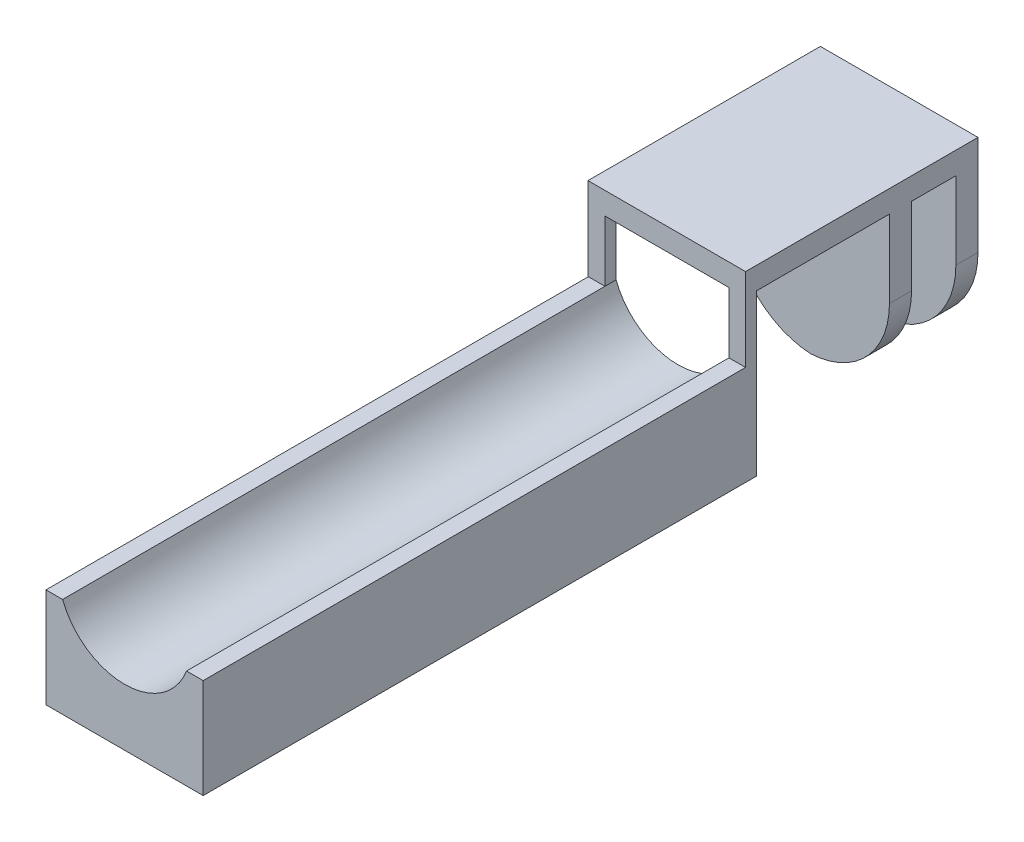
ISO-10303-21;
HEADER;
FILE_DESCRIPTION(('STEP AP214'),'2;1');
FILE_NAME('part.step','',(''),(''),'','','');
FILE_SCHEMA(('AUTOMOTIVE_DESIGN { 1 0 10303 214 1 1 1 1 }'));
ENDSEC;
DATA;
#1=APPLICATION_CONTEXT('core data for automotive mechanical design processes');
#2=APPLICATION_PROTOCOL_DEFINITION('international standard','automotive_design',2000,#1);
#3=PRODUCT_CONTEXT('',#1,'mechanical');
#4=PRODUCT('Part','Part','',(#3));
#5=PRODUCT_RELATED_PRODUCT_CATEGORY('part','',(#4));
#6=PRODUCT_DEFINITION_FORMATION('','',#4);
#7=PRODUCT_DEFINITION_CONTEXT('part definition',#1,'design');
#8=PRODUCT_DEFINITION('design','',#6,#7);
#9=PRODUCT_DEFINITION_SHAPE('','',#8);
#10=(LENGTH_UNIT() NAMED_UNIT(*) SI_UNIT(.MILLI.,.METRE.));
#11=(NAMED_UNIT(*) PLANE_ANGLE_UNIT() SI_UNIT($,.RADIAN.));
#12=(NAMED_UNIT(*) SI_UNIT($,.STERADIAN.) SOLID_ANGLE_UNIT());
#13=UNCERTAINTY_MEASURE_WITH_UNIT(LENGTH_MEASURE(1.E-05),#10,'distance_accuracy_value','');
#14=(GEOMETRIC_REPRESENTATION_CONTEXT(3) GLOBAL_UNCERTAINTY_ASSIGNED_CONTEXT((#13)) GLOBAL_UNIT_ASSIGNED_CONTEXT((#10,
#11,#12)) REPRESENTATION_CONTEXT('',''));
#15=CARTESIAN_POINT('',(0.,0.,0.));
#16=DIRECTION('',(0.,0.,1.));
#17=DIRECTION('',(1.,0.,0.));
#18=AXIS2_PLACEMENT_3D('',#15,#16,#17);
#19=CARTESIAN_POINT('',(0.,110.,20.));
#20=DIRECTION('',(0.,-1.,0.));
#21=DIRECTION('',(0.,0.,-1.));
#22=AXIS2_PLACEMENT_3D('',#19,#20,#21);
#23=PLANE('',#22);
#24=DIRECTION('',(0.,0.,1.));
#25=VECTOR('',#24,1.);
#26=CARTESIAN_POINT('',(-254.767845468869,110.,-400.));
#27=LINE('',#26,#25);
#28=CARTESIAN_POINT('',(-254.767845468869,110.,-240.));
#29=VERTEX_POINT('',#28);
#30=CARTESIAN_POINT('',(-254.767845468869,110.,0.));
#31=VERTEX_POINT('',#30);
#32=EDGE_CURVE('E225',#29,#31,#27,.T.);
#33=ORIENTED_EDGE('',*,*,#32,.F.);
#34=DIRECTION('',(-1.,0.,0.));
#35=VECTOR('',#34,1.);
#36=CARTESIAN_POINT('',(-254.767845468869,110.,-240.));
#37=LINE('',#36,#35);
#38=CARTESIAN_POINT('',(30.,110.,-240.));
#39=VERTEX_POINT('',#38);
#40=EDGE_CURVE('E215',#39,#29,#37,.T.);
#41=ORIENTED_EDGE('',*,*,#40,.F.);
#42=DIRECTION('',(0.,0.,1.));
#43=VECTOR('',#42,1.);
#44=CARTESIAN_POINT('',(30.,110.,-400.));
#45=LINE('',#44,#43);
#46=CARTESIAN_POINT('',(30.,110.,0.));
#47=VERTEX_POINT('',#46);
#48=EDGE_CURVE('E224',#39,#47,#45,.T.);
#49=ORIENTED_EDGE('',*,*,#48,.T.);
#50=DIRECTION('',(-1.,0.,0.));
#51=VECTOR('',#50,1.);
#52=CARTESIAN_POINT('',(30.,110.,0.));
#53=LINE('',#52,#51);
#54=CARTESIAN_POINT('',(0.,110.,0.));
#55=VERTEX_POINT('',#54);
#56=EDGE_CURVE('E230',#47,#55,#53,.T.);
#57=ORIENTED_EDGE('',*,*,#56,.T.);
#58=DIRECTION('',(0.,0.,-1.));
#59=VECTOR('',#58,1.);
#60=CARTESIAN_POINT('',(0.,110.,20.));
#61=LINE('',#60,#59);
#62=CARTESIAN_POINT('',(0.,110.,20.));
#63=VERTEX_POINT('',#62);
#64=EDGE_CURVE('E257',#63,#55,#61,.T.);
#65=ORIENTED_EDGE('',*,*,#64,.F.);
#66=DIRECTION('',(-1.,0.,0.));
#67=VECTOR('',#66,1.);
#68=CARTESIAN_POINT('',(0.,110.,20.));
#69=LINE('',#68,#67);
#70=CARTESIAN_POINT('',(-223.996890486914,110.,20.));
#71=VERTEX_POINT('',#70);
#72=EDGE_CURVE('E237',#63,#71,#69,.T.);
#73=ORIENTED_EDGE('',*,*,#72,.T.);
#74=DIRECTION('',(0.,0.,-1.));
#75=VECTOR('',#74,1.);
#76=CARTESIAN_POINT('',(-223.996890486914,110.,20.));
#77=LINE('',#76,#75);
#78=CARTESIAN_POINT('',(-223.996890486914,110.,0.));
#79=VERTEX_POINT('',#78);
#80=EDGE_CURVE('E282',#71,#79,#77,.T.);
#81=ORIENTED_EDGE('',*,*,#80,.T.);
#82=EDGE_CURVE('E327',#79,#31,#53,.T.);
#83=ORIENTED_EDGE('',*,*,#82,.T.);
#84=EDGE_LOOP('',(#33,#41,#49,#57,#65,#73,#81,#83));
#85=FACE_BOUND('',#84,.T.);
#86=ADVANCED_FACE('F43',(#85),#23,.T.);
#87=CARTESIAN_POINT('',(30.,110.,-360.));
#88=VERTEX_POINT('',#87);
#89=CARTESIAN_POINT('',(30.,110.,-280.));
#90=VERTEX_POINT('',#89);
#91=EDGE_CURVE('E214',#88,#90,#45,.T.);
#92=ORIENTED_EDGE('',*,*,#91,.T.);
#93=DIRECTION('',(1.,0.,0.));
#94=VECTOR('',#93,1.);
#95=CARTESIAN_POINT('',(-254.767845468869,110.,-280.));
#96=LINE('',#95,#94);
#97=CARTESIAN_POINT('',(-254.767845468869,110.,-280.));
#98=VERTEX_POINT('',#97);
#99=EDGE_CURVE('E198',#98,#90,#96,.T.);
#100=ORIENTED_EDGE('',*,*,#99,.F.);
#101=CARTESIAN_POINT('',(-254.767845468869,110.,-360.));
#102=VERTEX_POINT('',#101);
#103=EDGE_CURVE('E212',#102,#98,#27,.T.);
#104=ORIENTED_EDGE('',*,*,#103,.F.);
#105=DIRECTION('',(-1.,0.,0.));
#106=VECTOR('',#105,1.);
#107=CARTESIAN_POINT('',(-254.767845468869,110.,-360.));
#108=LINE('',#107,#106);
#109=EDGE_CURVE('E205',#88,#102,#108,.T.);
#110=ORIENTED_EDGE('',*,*,#109,.F.);
#111=EDGE_LOOP('',(#92,#100,#104,#110));
#112=FACE_BOUND('',#111,.T.);
#113=ADVANCED_FACE('F210',(#112),#23,.T.);
#114=CARTESIAN_POINT('',(-223.996890486914,0.,1000.));
#115=DIRECTION('',(0.,-1.,0.));
#116=DIRECTION('',(1.,0.,0.));
#117=AXIS2_PLACEMENT_3D('',#114,#115,#116);
#118=PLANE('',#117);
#119=DIRECTION('',(1.,0.,0.));
#120=VECTOR('',#119,1.);
#121=CARTESIAN_POINT('',(0.,0.,20.));
#122=LINE('',#121,#120);
#123=CARTESIAN_POINT('',(-253.996890486914,0.,20.));
#124=VERTEX_POINT('',#123);
#125=CARTESIAN_POINT('',(-223.996890486914,0.,20.));
#126=VERTEX_POINT('',#125);
#127=EDGE_CURVE('E243',#124,#126,#122,.T.);
#128=ORIENTED_EDGE('',*,*,#127,.F.);
#129=DIRECTION('',(0.,0.,-1.));
#130=VECTOR('',#129,1.);
#131=CARTESIAN_POINT('',(-253.996890486914,0.,1000.));
#132=LINE('',#131,#130);
#133=CARTESIAN_POINT('',(-253.996890486914,0.,1000.));
#134=VERTEX_POINT('',#133);
#135=EDGE_CURVE('E321',#134,#124,#132,.T.);
#136=ORIENTED_EDGE('',*,*,#135,.F.);
#137=DIRECTION('',(-1.,0.,0.));
#138=VECTOR('',#137,1.);
#139=CARTESIAN_POINT('',(-223.996890486914,0.,1000.));
#140=LINE('',#139,#138);
#141=CARTESIAN_POINT('',(-223.996890486914,0.,1000.));
#142=VERTEX_POINT('',#141);
#143=EDGE_CURVE('E292',#142,#134,#140,.T.);
#144=ORIENTED_EDGE('',*,*,#143,.F.);
#145=DIRECTION('',(0.,0.,-1.));
#146=VECTOR('',#145,1.);
#147=CARTESIAN_POINT('',(-223.996890486914,0.,1000.));
#148=LINE('',#147,#146);
#149=EDGE_CURVE('E324',#142,#126,#148,.T.);
#150=ORIENTED_EDGE('',*,*,#149,.T.);
#151=EDGE_LOOP('',(#128,#136,#144,#150));
#152=FACE_BOUND('',#151,.T.);
#153=ADVANCED_FACE('F426',(#152),#118,.F.);
#154=CARTESIAN_POINT('',(30.,0.,1000.));
#155=DIRECTION('',(0.,-1.,0.));
#156=DIRECTION('',(1.,0.,0.));
#157=AXIS2_PLACEMENT_3D('',#154,#155,#156);
#158=PLANE('',#157);
#159=DIRECTION('',(1.,0.,0.));
#160=VECTOR('',#159,1.);
#161=CARTESIAN_POINT('',(0.,0.,20.));
#162=LINE('',#161,#160);
#163=CARTESIAN_POINT('',(0.,0.,20.));
#164=VERTEX_POINT('',#163);
#165=CARTESIAN_POINT('',(30.,0.,20.));
#166=VERTEX_POINT('',#165);
#167=EDGE_CURVE('E254',#164,#166,#162,.T.);
#168=ORIENTED_EDGE('',*,*,#167,.F.);
#169=DIRECTION('',(0.,0.,-1.));
#170=VECTOR('',#169,1.);
#171=CARTESIAN_POINT('',(0.,0.,1000.));
#172=LINE('',#171,#170);
#173=CARTESIAN_POINT('',(0.,0.,1000.));
#174=VERTEX_POINT('',#173);
#175=EDGE_CURVE('E303',#174,#164,#172,.T.);
#176=ORIENTED_EDGE('',*,*,#175,.F.);
#177=DIRECTION('',(-1.,0.,0.));
#178=VECTOR('',#177,1.);
#179=CARTESIAN_POINT('',(30.,0.,1000.));
#180=LINE('',#179,#178);
#181=CARTESIAN_POINT('',(30.,0.,1000.));
#182=VERTEX_POINT('',#181);
#183=EDGE_CURVE('E301',#182,#174,#180,.T.);
#184=ORIENTED_EDGE('',*,*,#183,.F.);
#185=DIRECTION('',(0.,0.,-1.));
#186=VECTOR('',#185,1.);
#187=CARTESIAN_POINT('',(30.,0.,1000.));
#188=LINE('',#187,#186);
#189=EDGE_CURVE('E313',#182,#166,#188,.T.);
#190=ORIENTED_EDGE('',*,*,#189,.T.);
#191=EDGE_LOOP('',(#168,#176,#184,#190));
#192=FACE_BOUND('',#191,.T.);
#193=ADVANCED_FACE('F446',(#192),#158,.F.);
#194=CARTESIAN_POINT('',(-111.998445243457,43.0853601940189,1000.));
#195=DIRECTION('',(0.,0.,-1.));
#196=DIRECTION('',(-1.,0.,0.));
#197=AXIS2_PLACEMENT_3D('',#194,#195,#196);
#198=CYLINDRICAL_SURFACE('',#197,120.);
#199=CARTESIAN_POINT('',(-111.998445243457,43.0853601940189,0.));
#200=DIRECTION('',(0.,0.,-1.));
#201=DIRECTION('',(-1.,0.,0.));
#202=AXIS2_PLACEMENT_3D('',#199,#200,#201);
#203=CIRCLE('',#202,120.);
#204=CARTESIAN_POINT('',(0.,0.,0.));
#205=VERTEX_POINT('',#204);
#206=CARTESIAN_POINT('',(-223.996890486914,0.,0.));
#207=VERTEX_POINT('',#206);
#208=EDGE_CURVE('E288',#205,#207,#203,.T.);
#209=ORIENTED_EDGE('',*,*,#208,.T.);
#210=DIRECTION('',(0.,0.,-1.));
#211=VECTOR('',#210,1.);
#212=CARTESIAN_POINT('',(-223.996890486914,0.,20.));
#213=LINE('',#212,#211);
#214=EDGE_CURVE('E279',#126,#207,#213,.T.);
#215=ORIENTED_EDGE('',*,*,#214,.F.);
#216=ORIENTED_EDGE('',*,*,#149,.F.);
#217=CARTESIAN_POINT('',(-111.998445243457,43.0853601940189,1000.));
#218=DIRECTION('',(0.,0.,-1.));
#219=DIRECTION('',(-1.,0.,0.));
#220=AXIS2_PLACEMENT_3D('',#217,#218,#219);
#221=CIRCLE('',#220,120.);
#222=EDGE_CURVE('E289',#174,#142,#221,.T.);
#223=ORIENTED_EDGE('',*,*,#222,.F.);
#224=ORIENTED_EDGE('',*,*,#175,.T.);
#225=DIRECTION('',(0.,0.,-1.));
#226=VECTOR('',#225,1.);
#227=CARTESIAN_POINT('',(0.,0.,20.));
#228=LINE('',#227,#226);
#229=EDGE_CURVE('E268',#164,#205,#228,.T.);
#230=ORIENTED_EDGE('',*,*,#229,.T.);
#231=EDGE_LOOP('',(#209,#215,#216,#223,#224,#230));
#232=FACE_BOUND('',#231,.T.);
#233=ADVANCED_FACE('F449',(#232),#198,.F.);
#234=CARTESIAN_POINT('',(-253.996890486914,0.,1000.));
#235=DIRECTION('',(1.,0.,0.));
#236=DIRECTION('',(0.,0.,-1.));
#237=AXIS2_PLACEMENT_3D('',#234,#235,#236);
#238=PLANE('',#237);
#239=DIRECTION('',(0.,-1.,0.));
#240=VECTOR('',#239,1.);
#241=CARTESIAN_POINT('',(-253.996890486914,0.,0.));
#242=LINE('',#241,#240);
#243=CARTESIAN_POINT('',(-253.996890486914,0.,0.));
#244=VERTEX_POINT('',#243);
#245=CARTESIAN_POINT('',(-253.996890486914,-180.,0.));
#246=VERTEX_POINT('',#245);
#247=EDGE_CURVE('E305',#244,#246,#242,.T.);
#248=ORIENTED_EDGE('',*,*,#247,.T.);
#249=DIRECTION('',(0.,0.,-1.));
#250=VECTOR('',#249,1.);
#251=CARTESIAN_POINT('',(-253.996890486914,-180.,1000.));
#252=LINE('',#251,#250);
#253=CARTESIAN_POINT('',(-253.996890486914,-180.,1000.));
#254=VERTEX_POINT('',#253);
#255=EDGE_CURVE('E318',#254,#246,#252,.T.);
#256=ORIENTED_EDGE('',*,*,#255,.F.);
#257=DIRECTION('',(0.,-1.,0.));
#258=VECTOR('',#257,1.);
#259=CARTESIAN_POINT('',(-253.996890486914,0.,1000.));
#260=LINE('',#259,#258);
#261=EDGE_CURVE('E295',#134,#254,#260,.T.);
#262=ORIENTED_EDGE('',*,*,#261,.F.);
#263=ORIENTED_EDGE('',*,*,#135,.T.);
#264=DIRECTION('',(0.,0.,1.));
#265=VECTOR('',#264,1.);
#266=CARTESIAN_POINT('',(-253.996890486914,0.,1000.));
#267=LINE('',#266,#265);
#268=EDGE_CURVE('E271',#244,#124,#267,.T.);
#269=ORIENTED_EDGE('',*,*,#268,.F.);
#270=EDGE_LOOP('',(#248,#256,#262,#263,#269));
#271=FACE_BOUND('',#270,.T.);
#272=ADVANCED_FACE('F456',(#271),#238,.F.);
#273=CARTESIAN_POINT('',(-253.996890486914,-180.,1000.));
#274=DIRECTION('',(0.,1.,0.));
#275=DIRECTION('',(0.,0.,1.));
#276=AXIS2_PLACEMENT_3D('',#273,#274,#275);
#277=PLANE('',#276);
#278=DIRECTION('',(1.,0.,0.));
#279=VECTOR('',#278,1.);
#280=CARTESIAN_POINT('',(-253.996890486914,-180.,0.));
#281=LINE('',#280,#279);
#282=CARTESIAN_POINT('',(30.,-180.,0.));
#283=VERTEX_POINT('',#282);
#284=EDGE_CURVE('E307',#246,#283,#281,.T.);
#285=ORIENTED_EDGE('',*,*,#284,.T.);
#286=DIRECTION('',(0.,0.,-1.));
#287=VECTOR('',#286,1.);
#288=CARTESIAN_POINT('',(30.,-180.,1000.));
#289=LINE('',#288,#287);
#290=CARTESIAN_POINT('',(30.,-180.,1000.));
#291=VERTEX_POINT('',#290);
#292=EDGE_CURVE('E315',#291,#283,#289,.T.);
#293=ORIENTED_EDGE('',*,*,#292,.F.);
#294=DIRECTION('',(1.,0.,0.));
#295=VECTOR('',#294,1.);
#296=CARTESIAN_POINT('',(-253.996890486914,-180.,1000.));
#297=LINE('',#296,#295);
#298=EDGE_CURVE('E297',#254,#291,#297,.T.);
#299=ORIENTED_EDGE('',*,*,#298,.F.);
#300=ORIENTED_EDGE('',*,*,#255,.T.);
#301=EDGE_LOOP('',(#285,#293,#299,#300));
#302=FACE_BOUND('',#301,.T.);
#303=ADVANCED_FACE('F453',(#302),#277,.F.);
#304=CARTESIAN_POINT('',(30.,-180.,1000.));
#305=DIRECTION('',(-1.,0.,0.));
#306=DIRECTION('',(0.,0.,1.));
#307=AXIS2_PLACEMENT_3D('',#304,#305,#306);
#308=PLANE('',#307);
#309=DIRECTION('',(0.,1.,0.));
#310=VECTOR('',#309,1.);
#311=CARTESIAN_POINT('',(30.,-467.56342919951,-360.));
#312=LINE('',#311,#310);
#313=CARTESIAN_POINT('',(30.,-30.,-360.));
#314=VERTEX_POINT('',#313);
#315=EDGE_CURVE('E381',#314,#88,#312,.T.);
#316=ORIENTED_EDGE('',*,*,#315,.F.);
#317=DIRECTION('',(0.,0.,-1.));
#318=VECTOR('',#317,1.);
#319=CARTESIAN_POINT('',(30.,-30.,1000.));
#320=LINE('',#319,#318);
#321=CARTESIAN_POINT('',(30.,-30.,-400.));
#322=VERTEX_POINT('',#321);
#323=EDGE_CURVE('E347',#314,#322,#320,.T.);
#324=ORIENTED_EDGE('',*,*,#323,.T.);
#325=DIRECTION('',(0.,-1.,0.));
#326=VECTOR('',#325,1.);
#327=CARTESIAN_POINT('',(30.,150.,-400.));
#328=LINE('',#327,#326);
#329=CARTESIAN_POINT('',(30.,150.,-400.));
#330=VERTEX_POINT('',#329);
#331=EDGE_CURVE('E383',#330,#322,#328,.T.);
#332=ORIENTED_EDGE('',*,*,#331,.F.);
#333=DIRECTION('',(0.,0.,-1.));
#334=VECTOR('',#333,1.);
#335=CARTESIAN_POINT('',(30.,150.,20.));
#336=LINE('',#335,#334);
#337=CARTESIAN_POINT('',(30.,150.,20.));
#338=VERTEX_POINT('',#337);
#339=EDGE_CURVE('E272',#338,#330,#336,.T.);
#340=ORIENTED_EDGE('',*,*,#339,.F.);
#341=DIRECTION('',(0.,1.,0.));
#342=VECTOR('',#341,1.);
#343=CARTESIAN_POINT('',(30.,0.,20.));
#344=LINE('',#343,#342);
#345=EDGE_CURVE('E252',#166,#338,#344,.T.);
#346=ORIENTED_EDGE('',*,*,#345,.F.);
#347=ORIENTED_EDGE('',*,*,#189,.F.);
#348=DIRECTION('',(0.,1.,0.));
#349=VECTOR('',#348,1.);
#350=CARTESIAN_POINT('',(30.,-180.,1000.));
#351=LINE('',#350,#349);
#352=EDGE_CURVE('E299',#291,#182,#351,.T.);
#353=ORIENTED_EDGE('',*,*,#352,.F.);
#354=ORIENTED_EDGE('',*,*,#292,.T.);
#355=DIRECTION('',(0.,1.,0.));
#356=VECTOR('',#355,1.);
#357=CARTESIAN_POINT('',(30.,-180.,0.));
#358=LINE('',#357,#356);
#359=EDGE_CURVE('E293',#283,#47,#358,.T.);
#360=ORIENTED_EDGE('',*,*,#359,.T.);
#361=ORIENTED_EDGE('',*,*,#48,.F.);
#362=DIRECTION('',(0.,1.,0.));
#363=VECTOR('',#362,1.);
#364=CARTESIAN_POINT('',(30.,-467.56342919951,-240.));
#365=LINE('',#364,#363);
#366=CARTESIAN_POINT('',(30.,-30.,-240.));
#367=VERTEX_POINT('',#366);
#368=EDGE_CURVE('E367',#367,#39,#365,.T.);
#369=ORIENTED_EDGE('',*,*,#368,.F.);
#370=DIRECTION('',(0.,0.,-1.));
#371=VECTOR('',#370,1.);
#372=CARTESIAN_POINT('',(30.,-30.,1000.));
#373=LINE('',#372,#371);
#374=CARTESIAN_POINT('',(30.,-30.,-280.));
#375=VERTEX_POINT('',#374);
#376=EDGE_CURVE('E345',#367,#375,#373,.T.);
#377=ORIENTED_EDGE('',*,*,#376,.T.);
#378=DIRECTION('',(0.,1.,0.));
#379=VECTOR('',#378,1.);
#380=CARTESIAN_POINT('',(30.,-467.56342919951,-280.));
#381=LINE('',#380,#379);
#382=EDGE_CURVE('E206',#375,#90,#381,.T.);
#383=ORIENTED_EDGE('',*,*,#382,.T.);
#384=ORIENTED_EDGE('',*,*,#91,.F.);
#385=EDGE_LOOP('',(#316,#324,#332,#340,#346,#347,#353,#354,#360,#361,#369,#377,#383,#384));
#386=FACE_BOUND('',#385,.T.);
#387=ADVANCED_FACE('F372',(#386),#308,.F.);
#388=CARTESIAN_POINT('',(-111.998445243457,43.0853601940189,1000.));
#389=DIRECTION('',(0.,0.,-1.));
#390=DIRECTION('',(-1.,0.,0.));
#391=AXIS2_PLACEMENT_3D('',#388,#389,#390);
#392=PLANE('',#391);
#393=ORIENTED_EDGE('',*,*,#222,.T.);
#394=ORIENTED_EDGE('',*,*,#143,.T.);
#395=ORIENTED_EDGE('',*,*,#261,.T.);
#396=ORIENTED_EDGE('',*,*,#298,.T.);
#397=ORIENTED_EDGE('',*,*,#352,.T.);
#398=ORIENTED_EDGE('',*,*,#183,.T.);
#399=EDGE_LOOP('',(#393,#394,#395,#396,#397,#398));
#400=FACE_BOUND('',#399,.T.);
#401=ADVANCED_FACE('F438',(#400),#392,.F.);
#402=CARTESIAN_POINT('',(-111.998445243457,43.0853601940189,0.));
#403=DIRECTION('',(0.,0.,-1.));
#404=DIRECTION('',(-1.,0.,0.));
#405=AXIS2_PLACEMENT_3D('',#402,#403,#404);
#406=PLANE('',#405);
#407=ORIENTED_EDGE('',*,*,#56,.F.);
#408=ORIENTED_EDGE('',*,*,#359,.F.);
#409=ORIENTED_EDGE('',*,*,#284,.F.);
#410=ORIENTED_EDGE('',*,*,#247,.F.);
#411=DIRECTION('',(1.,0.,0.));
#412=VECTOR('',#411,1.);
#413=CARTESIAN_POINT('',(0.,0.,0.));
#414=LINE('',#413,#412);
#415=CARTESIAN_POINT('',(-254.767845468869,0.,0.));
#416=VERTEX_POINT('',#415);
#417=EDGE_CURVE('E263',#416,#244,#414,.T.);
#418=ORIENTED_EDGE('',*,*,#417,.F.);
#419=DIRECTION('',(0.,1.,0.));
#420=VECTOR('',#419,1.);
#421=CARTESIAN_POINT('',(-254.767845468869,0.,0.));
#422=LINE('',#421,#420);
#423=EDGE_CURVE('E238',#416,#31,#422,.T.);
#424=ORIENTED_EDGE('',*,*,#423,.T.);
#425=ORIENTED_EDGE('',*,*,#82,.F.);
#426=DIRECTION('',(0.,1.,0.));
#427=VECTOR('',#426,1.);
#428=CARTESIAN_POINT('',(-223.996890486914,0.,0.));
#429=LINE('',#428,#427);
#430=EDGE_CURVE('E260',#207,#79,#429,.T.);
#431=ORIENTED_EDGE('',*,*,#430,.F.);
#432=ORIENTED_EDGE('',*,*,#208,.F.);
#433=DIRECTION('',(0.,1.,0.));
#434=VECTOR('',#433,1.);
#435=CARTESIAN_POINT('',(0.,0.,0.));
#436=LINE('',#435,#434);
#437=EDGE_CURVE('E233',#205,#55,#436,.T.);
#438=ORIENTED_EDGE('',*,*,#437,.T.);
#439=EDGE_LOOP('',(#407,#408,#409,#410,#418,#424,#425,#431,#432,#438));
#440=FACE_BOUND('',#439,.T.);
#441=ADVANCED_FACE('F441',(#440),#406,.T.);
#442=CARTESIAN_POINT('',(0.,0.,20.));
#443=DIRECTION('',(0.,1.,0.));
#444=DIRECTION('',(-1.,0.,0.));
#445=AXIS2_PLACEMENT_3D('',#442,#443,#444);
#446=PLANE('',#445);
#447=ORIENTED_EDGE('',*,*,#417,.T.);
#448=ORIENTED_EDGE('',*,*,#268,.T.);
#449=CARTESIAN_POINT('',(-254.767845468869,0.,20.));
#450=VERTEX_POINT('',#449);
#451=EDGE_CURVE('E244',#450,#124,#122,.T.);
#452=ORIENTED_EDGE('',*,*,#451,.F.);
#453=DIRECTION('',(0.,0.,-1.));
#454=VECTOR('',#453,1.);
#455=CARTESIAN_POINT('',(-254.767845468869,0.,20.));
#456=LINE('',#455,#454);
#457=EDGE_CURVE('E277',#450,#416,#456,.T.);
#458=ORIENTED_EDGE('',*,*,#457,.T.);
#459=EDGE_LOOP('',(#447,#448,#452,#458));
#460=FACE_BOUND('',#459,.T.);
#461=ADVANCED_FACE('F436',(#460),#446,.F.);
#462=CARTESIAN_POINT('',(0.,0.,20.));
#463=DIRECTION('',(-1.,0.,0.));
#464=DIRECTION('',(0.,0.,1.));
#465=AXIS2_PLACEMENT_3D('',#462,#463,#464);
#466=PLANE('',#465);
#467=ORIENTED_EDGE('',*,*,#437,.F.);
#468=ORIENTED_EDGE('',*,*,#229,.F.);
#469=DIRECTION('',(0.,1.,0.));
#470=VECTOR('',#469,1.);
#471=CARTESIAN_POINT('',(0.,0.,20.));
#472=LINE('',#471,#470);
#473=EDGE_CURVE('E234',#164,#63,#472,.T.);
#474=ORIENTED_EDGE('',*,*,#473,.T.);
#475=ORIENTED_EDGE('',*,*,#64,.T.);
#476=EDGE_LOOP('',(#467,#468,#474,#475));
#477=FACE_BOUND('',#476,.T.);
#478=ADVANCED_FACE('F432',(#477),#466,.T.);
#479=CARTESIAN_POINT('',(0.,150.,20.));
#480=DIRECTION('',(0.,-1.,0.));
#481=DIRECTION('',(0.,0.,-1.));
#482=AXIS2_PLACEMENT_3D('',#479,#480,#481);
#483=PLANE('',#482);
#484=ORIENTED_EDGE('',*,*,#339,.T.);
#485=DIRECTION('',(1.,0.,0.));
#486=VECTOR('',#485,1.);
#487=CARTESIAN_POINT('',(30.,150.,-400.));
#488=LINE('',#487,#486);
#489=CARTESIAN_POINT('',(-254.767845468869,150.,-400.));
#490=VERTEX_POINT('',#489);
#491=EDGE_CURVE('E228',#490,#330,#488,.T.);
#492=ORIENTED_EDGE('',*,*,#491,.F.);
#493=DIRECTION('',(0.,0.,-1.));
#494=VECTOR('',#493,1.);
#495=CARTESIAN_POINT('',(-254.767845468869,150.,20.));
#496=LINE('',#495,#494);
#497=CARTESIAN_POINT('',(-254.767845468869,150.,20.));
#498=VERTEX_POINT('',#497);
#499=EDGE_CURVE('E274',#498,#490,#496,.T.);
#500=ORIENTED_EDGE('',*,*,#499,.F.);
#501=DIRECTION('',(-1.,0.,0.));
#502=VECTOR('',#501,1.);
#503=CARTESIAN_POINT('',(0.,150.,20.));
#504=LINE('',#503,#502);
#505=EDGE_CURVE('E250',#338,#498,#504,.T.);
#506=ORIENTED_EDGE('',*,*,#505,.F.);
#507=EDGE_LOOP('',(#484,#492,#500,#506));
#508=FACE_BOUND('',#507,.T.);
#509=ADVANCED_FACE('F435',(#508),#483,.F.);
#510=CARTESIAN_POINT('',(-254.767845468869,0.,20.));
#511=DIRECTION('',(-1.,0.,0.));
#512=DIRECTION('',(0.,0.,1.));
#513=AXIS2_PLACEMENT_3D('',#510,#511,#512);
#514=PLANE('',#513);
#515=DIRECTION('',(0.,1.,0.));
#516=VECTOR('',#515,1.);
#517=CARTESIAN_POINT('',(-254.767845468869,150.,-400.));
#518=LINE('',#517,#516);
#519=CARTESIAN_POINT('',(-254.767845468869,-30.,-400.));
#520=VERTEX_POINT('',#519);
#521=EDGE_CURVE('E386',#520,#490,#518,.T.);
#522=ORIENTED_EDGE('',*,*,#521,.F.);
#523=DIRECTION('',(0.,0.,1.));
#524=VECTOR('',#523,1.);
#525=CARTESIAN_POINT('',(-254.767845468869,-30.,-360.));
#526=LINE('',#525,#524);
#527=CARTESIAN_POINT('',(-254.767845468869,-30.,-360.));
#528=VERTEX_POINT('',#527);
#529=EDGE_CURVE('E335',#520,#528,#526,.T.);
#530=ORIENTED_EDGE('',*,*,#529,.T.);
#531=DIRECTION('',(0.,1.,0.));
#532=VECTOR('',#531,1.);
#533=CARTESIAN_POINT('',(-254.767845468869,-467.56342919951,-360.));
#534=LINE('',#533,#532);
#535=EDGE_CURVE('E222',#528,#102,#534,.T.);
#536=ORIENTED_EDGE('',*,*,#535,.T.);
#537=ORIENTED_EDGE('',*,*,#103,.T.);
#538=DIRECTION('',(0.,1.,0.));
#539=VECTOR('',#538,1.);
#540=CARTESIAN_POINT('',(-254.767845468869,-467.56342919951,-280.));
#541=LINE('',#540,#539);
#542=CARTESIAN_POINT('',(-254.767845468869,-30.,-280.));
#543=VERTEX_POINT('',#542);
#544=EDGE_CURVE('E195',#543,#98,#541,.T.);
#545=ORIENTED_EDGE('',*,*,#544,.F.);
#546=DIRECTION('',(0.,0.,1.));
#547=VECTOR('',#546,1.);
#548=CARTESIAN_POINT('',(-254.767845468869,-30.,-240.));
#549=LINE('',#548,#547);
#550=CARTESIAN_POINT('',(-254.767845468869,-30.,-240.));
#551=VERTEX_POINT('',#550);
#552=EDGE_CURVE('E333',#543,#551,#549,.T.);
#553=ORIENTED_EDGE('',*,*,#552,.T.);
#554=DIRECTION('',(0.,1.,0.));
#555=VECTOR('',#554,1.);
#556=CARTESIAN_POINT('',(-254.767845468869,-467.56342919951,-240.));
#557=LINE('',#556,#555);
#558=EDGE_CURVE('E373',#551,#29,#557,.T.);
#559=ORIENTED_EDGE('',*,*,#558,.T.);
#560=ORIENTED_EDGE('',*,*,#32,.T.);
#561=ORIENTED_EDGE('',*,*,#423,.F.);
#562=ORIENTED_EDGE('',*,*,#457,.F.);
#563=DIRECTION('',(0.,1.,0.));
#564=VECTOR('',#563,1.);
#565=CARTESIAN_POINT('',(-254.767845468869,0.,20.));
#566=LINE('',#565,#564);
#567=EDGE_CURVE('E247',#450,#498,#566,.T.);
#568=ORIENTED_EDGE('',*,*,#567,.T.);
#569=ORIENTED_EDGE('',*,*,#499,.T.);
#570=EDGE_LOOP('',(#522,#530,#536,#537,#545,#553,#559,#560,#561,#562,#568,#569));
#571=FACE_BOUND('',#570,.T.);
#572=ADVANCED_FACE('F219',(#571),#514,.T.);
#573=CARTESIAN_POINT('',(-223.996890486914,0.,20.));
#574=DIRECTION('',(-1.,0.,0.));
#575=DIRECTION('',(0.,0.,1.));
#576=AXIS2_PLACEMENT_3D('',#573,#574,#575);
#577=PLANE('',#576);
#578=ORIENTED_EDGE('',*,*,#430,.T.);
#579=ORIENTED_EDGE('',*,*,#80,.F.);
#580=DIRECTION('',(0.,1.,0.));
#581=VECTOR('',#580,1.);
#582=CARTESIAN_POINT('',(-223.996890486914,0.,20.));
#583=LINE('',#582,#581);
#584=EDGE_CURVE('E241',#126,#71,#583,.T.);
#585=ORIENTED_EDGE('',*,*,#584,.F.);
#586=ORIENTED_EDGE('',*,*,#214,.T.);
#587=EDGE_LOOP('',(#578,#579,#585,#586));
#588=FACE_BOUND('',#587,.T.);
#589=ADVANCED_FACE('F430',(#588),#577,.F.);
#590=CARTESIAN_POINT('',(0.,0.,20.));
#591=DIRECTION('',(0.,0.,-1.));
#592=DIRECTION('',(-1.,0.,0.));
#593=AXIS2_PLACEMENT_3D('',#590,#591,#592);
#594=PLANE('',#593);
#595=ORIENTED_EDGE('',*,*,#473,.F.);
#596=ORIENTED_EDGE('',*,*,#167,.T.);
#597=ORIENTED_EDGE('',*,*,#345,.T.);
#598=ORIENTED_EDGE('',*,*,#505,.T.);
#599=ORIENTED_EDGE('',*,*,#567,.F.);
#600=ORIENTED_EDGE('',*,*,#451,.T.);
#601=ORIENTED_EDGE('',*,*,#127,.T.);
#602=ORIENTED_EDGE('',*,*,#584,.T.);
#603=ORIENTED_EDGE('',*,*,#72,.F.);
#604=EDGE_LOOP('',(#595,#596,#597,#598,#599,#600,#601,#602,#603));
#605=FACE_BOUND('',#604,.T.);
#606=ADVANCED_FACE('F415',(#605),#594,.F.);
#607=CARTESIAN_POINT('',(0.,0.,-400.));
#608=DIRECTION('',(0.,0.,-1.));
#609=DIRECTION('',(-1.,0.,0.));
#610=AXIS2_PLACEMENT_3D('',#607,#608,#609);
#611=PLANE('',#610);
#612=CARTESIAN_POINT('',(-111.998445243457,43.0853601940189,-400.));
#613=DIRECTION('',(0.,0.,-1.));
#614=DIRECTION('',(-1.,0.,0.));
#615=AXIS2_PLACEMENT_3D('',#612,#613,#614);
#616=CIRCLE('',#615,12.);
#617=CARTESIAN_POINT('',(-123.998445243457,43.0853601940189,-400.));
#618=VERTEX_POINT('',#617);
#619=EDGE_CURVE('E332',#618,#618,#616,.T.);
#620=ORIENTED_EDGE('',*,*,#619,.F.);
#621=EDGE_LOOP('',(#620));
#622=FACE_BOUND('',#621,.T.);
#623=CARTESIAN_POINT('',(-120.,-30.,-400.));
#624=DIRECTION('',(0.,0.,-1.));
#625=DIRECTION('',(-1.,0.,0.));
#626=AXIS2_PLACEMENT_3D('',#623,#624,#625);
#627=CIRCLE('',#626,150.);
#628=CARTESIAN_POINT('',(-112.383922734434,-179.806526450235,-400.));
#629=VERTEX_POINT('',#628);
#630=EDGE_CURVE('E341',#322,#629,#627,.T.);
#631=ORIENTED_EDGE('',*,*,#630,.T.);
#632=CARTESIAN_POINT('',(-104.767845468869,-30.,-400.));
#633=DIRECTION('',(0.,0.,-1.));
#634=DIRECTION('',(-1.,0.,0.));
#635=AXIS2_PLACEMENT_3D('',#632,#633,#634);
#636=CIRCLE('',#635,150.);
#637=EDGE_CURVE('E343',#629,#520,#636,.T.);
#638=ORIENTED_EDGE('',*,*,#637,.T.);
#639=ORIENTED_EDGE('',*,*,#521,.T.);
#640=ORIENTED_EDGE('',*,*,#491,.T.);
#641=ORIENTED_EDGE('',*,*,#331,.T.);
#642=EDGE_LOOP('',(#631,#638,#639,#640,#641));
#643=FACE_BOUND('',#642,.T.);
#644=ADVANCED_FACE('F391',(#622,#643),#611,.T.);
#645=CARTESIAN_POINT('',(-254.767845468869,-467.56342919951,-360.));
#646=DIRECTION('',(0.,0.,-1.));
#647=DIRECTION('',(-1.,0.,0.));
#648=AXIS2_PLACEMENT_3D('',#645,#646,#647);
#649=PLANE('',#648);
#650=CARTESIAN_POINT('',(-111.998445243457,43.0853601940189,-360.));
#651=DIRECTION('',(0.,0.,-1.));
#652=DIRECTION('',(-1.,0.,0.));
#653=AXIS2_PLACEMENT_3D('',#650,#651,#652);
#654=CIRCLE('',#653,12.);
#655=CARTESIAN_POINT('',(-123.998445243457,43.0853601940189,-360.));
#656=VERTEX_POINT('',#655);
#657=EDGE_CURVE('E216',#656,#656,#654,.T.);
#658=ORIENTED_EDGE('',*,*,#657,.T.);
#659=EDGE_LOOP('',(#658));
#660=FACE_BOUND('',#659,.T.);
#661=ORIENTED_EDGE('',*,*,#535,.F.);
#662=CARTESIAN_POINT('',(-104.767845468869,-30.,-360.));
#663=DIRECTION('',(0.,0.,-1.));
#664=DIRECTION('',(-1.,0.,0.));
#665=AXIS2_PLACEMENT_3D('',#662,#663,#664);
#666=CIRCLE('',#665,150.);
#667=CARTESIAN_POINT('',(-112.383922734434,-179.806526450235,-360.));
#668=VERTEX_POINT('',#667);
#669=EDGE_CURVE('E339',#528,#668,#666,.F.);
#670=ORIENTED_EDGE('',*,*,#669,.T.);
#671=CARTESIAN_POINT('',(-120.,-30.,-360.));
#672=DIRECTION('',(0.,0.,-1.));
#673=DIRECTION('',(-1.,0.,0.));
#674=AXIS2_PLACEMENT_3D('',#671,#672,#673);
#675=CIRCLE('',#674,150.);
#676=EDGE_CURVE('E337',#668,#314,#675,.F.);
#677=ORIENTED_EDGE('',*,*,#676,.T.);
#678=ORIENTED_EDGE('',*,*,#315,.T.);
#679=ORIENTED_EDGE('',*,*,#109,.T.);
#680=EDGE_LOOP('',(#661,#670,#677,#678,#679));
#681=FACE_BOUND('',#680,.T.);
#682=ADVANCED_FACE('F405',(#660,#681),#649,.F.);
#683=CARTESIAN_POINT('',(-254.767845468869,-467.56342919951,-240.));
#684=DIRECTION('',(0.,0.,-1.));
#685=DIRECTION('',(-1.,0.,0.));
#686=AXIS2_PLACEMENT_3D('',#683,#684,#685);
#687=PLANE('',#686);
#688=CARTESIAN_POINT('',(-111.998445243457,43.0853601940189,-240.));
#689=DIRECTION('',(0.,0.,-1.));
#690=DIRECTION('',(-1.,0.,0.));
#691=AXIS2_PLACEMENT_3D('',#688,#689,#690);
#692=CIRCLE('',#691,12.);
#693=CARTESIAN_POINT('',(-123.998445243457,43.0853601940189,-240.));
#694=VERTEX_POINT('',#693);
#695=EDGE_CURVE('E331',#694,#694,#692,.T.);
#696=ORIENTED_EDGE('',*,*,#695,.T.);
#697=EDGE_LOOP('',(#696));
#698=FACE_BOUND('',#697,.T.);
#699=ORIENTED_EDGE('',*,*,#558,.F.);
#700=CARTESIAN_POINT('',(-104.767845468869,-30.,-240.));
#701=DIRECTION('',(0.,0.,-1.));
#702=DIRECTION('',(-1.,0.,0.));
#703=AXIS2_PLACEMENT_3D('',#700,#701,#702);
#704=CIRCLE('',#703,150.);
#705=CARTESIAN_POINT('',(-112.383922734434,-179.806526450235,-240.));
#706=VERTEX_POINT('',#705);
#707=EDGE_CURVE('E66',#551,#706,#704,.F.);
#708=ORIENTED_EDGE('',*,*,#707,.T.);
#709=CARTESIAN_POINT('',(-120.,-30.,-240.));
#710=DIRECTION('',(0.,0.,-1.));
#711=DIRECTION('',(-1.,0.,0.));
#712=AXIS2_PLACEMENT_3D('',#709,#710,#711);
#713=CIRCLE('',#712,150.);
#714=EDGE_CURVE('E349',#706,#367,#713,.F.);
#715=ORIENTED_EDGE('',*,*,#714,.T.);
#716=ORIENTED_EDGE('',*,*,#368,.T.);
#717=ORIENTED_EDGE('',*,*,#40,.T.);
#718=EDGE_LOOP('',(#699,#708,#715,#716,#717));
#719=FACE_BOUND('',#718,.T.);
#720=ADVANCED_FACE('F365',(#698,#719),#687,.F.);
#721=CARTESIAN_POINT('',(-254.767845468869,-467.56342919951,-280.));
#722=DIRECTION('',(0.,0.,1.));
#723=DIRECTION('',(1.,0.,0.));
#724=AXIS2_PLACEMENT_3D('',#721,#722,#723);
#725=PLANE('',#724);
#726=CARTESIAN_POINT('',(-111.998445243457,43.0853601940189,-280.));
#727=DIRECTION('',(0.,0.,1.));
#728=DIRECTION('',(1.,0.,0.));
#729=AXIS2_PLACEMENT_3D('',#726,#727,#728);
#730=CIRCLE('',#729,12.);
#731=CARTESIAN_POINT('',(-99.9984452434571,43.0853601940189,-280.));
#732=VERTEX_POINT('',#731);
#733=EDGE_CURVE('E328',#732,#732,#730,.T.);
#734=ORIENTED_EDGE('',*,*,#733,.T.);
#735=EDGE_LOOP('',(#734));
#736=FACE_BOUND('',#735,.T.);
#737=CARTESIAN_POINT('',(-120.,-30.,-280.));
#738=DIRECTION('',(0.,0.,1.));
#739=DIRECTION('',(1.,0.,0.));
#740=AXIS2_PLACEMENT_3D('',#737,#738,#739);
#741=CIRCLE('',#740,150.);
#742=CARTESIAN_POINT('',(-112.383922734434,-179.806526450235,-280.));
#743=VERTEX_POINT('',#742);
#744=EDGE_CURVE('E52',#375,#743,#741,.F.);
#745=ORIENTED_EDGE('',*,*,#744,.T.);
#746=CARTESIAN_POINT('',(-104.767845468869,-30.,-280.));
#747=DIRECTION('',(0.,0.,1.));
#748=DIRECTION('',(1.,0.,0.));
#749=AXIS2_PLACEMENT_3D('',#746,#747,#748);
#750=CIRCLE('',#749,150.);
#751=EDGE_CURVE('E11',#743,#543,#750,.F.);
#752=ORIENTED_EDGE('',*,*,#751,.T.);
#753=ORIENTED_EDGE('',*,*,#544,.T.);
#754=ORIENTED_EDGE('',*,*,#99,.T.);
#755=ORIENTED_EDGE('',*,*,#382,.F.);
#756=EDGE_LOOP('',(#745,#752,#753,#754,#755));
#757=FACE_BOUND('',#756,.T.);
#758=ADVANCED_FACE('F197',(#736,#757),#725,.F.);
#759=CARTESIAN_POINT('',(-111.998445243457,43.0853601940189,-27.9999999999999));
#760=DIRECTION('',(0.,0.,-1.));
#761=DIRECTION('',(-1.,0.,0.));
#762=AXIS2_PLACEMENT_3D('',#759,#760,#761);
#763=CYLINDRICAL_SURFACE('',#762,12.);
#764=ORIENTED_EDGE('',*,*,#733,.F.);
#765=EDGE_LOOP('',(#764));
#766=FACE_BOUND('',#765,.T.);
#767=ORIENTED_EDGE('',*,*,#695,.F.);
#768=EDGE_LOOP('',(#767));
#769=FACE_BOUND('',#768,.T.);
#770=ADVANCED_FACE('F492',(#766,#769),#763,.F.);
#771=ORIENTED_EDGE('',*,*,#619,.T.);
#772=EDGE_LOOP('',(#771));
#773=FACE_BOUND('',#772,.T.);
#774=ORIENTED_EDGE('',*,*,#657,.F.);
#775=EDGE_LOOP('',(#774));
#776=FACE_BOUND('',#775,.T.);
#777=ADVANCED_FACE('F470',(#773,#776),#763,.F.);
#778=CARTESIAN_POINT('',(-120.,-30.,1000.));
#779=DIRECTION('',(0.,0.,-1.));
#780=DIRECTION('',(-1.,0.,0.));
#781=AXIS2_PLACEMENT_3D('',#778,#779,#780);
#782=CYLINDRICAL_SURFACE('',#781,150.);
#783=DIRECTION('',(0.,0.,-1.));
#784=VECTOR('',#783,1.);
#785=CARTESIAN_POINT('',(-112.383922734434,-179.806526450235,-380.));
#786=LINE('',#785,#784);
#787=EDGE_CURVE('E352',#629,#668,#786,.F.);
#788=ORIENTED_EDGE('',*,*,#787,.F.);
#789=ORIENTED_EDGE('',*,*,#630,.F.);
#790=ORIENTED_EDGE('',*,*,#323,.F.);
#791=ORIENTED_EDGE('',*,*,#676,.F.);
#792=EDGE_LOOP('',(#788,#789,#790,#791));
#793=FACE_BOUND('',#792,.T.);
#794=ADVANCED_FACE('F401',(#793),#782,.T.);
#795=CARTESIAN_POINT('',(-104.767845468869,-30.,20.));
#796=DIRECTION('',(0.,0.,-1.));
#797=DIRECTION('',(-1.,0.,0.));
#798=AXIS2_PLACEMENT_3D('',#795,#796,#797);
#799=CYLINDRICAL_SURFACE('',#798,150.);
#800=ORIENTED_EDGE('',*,*,#637,.F.);
#801=ORIENTED_EDGE('',*,*,#787,.T.);
#802=ORIENTED_EDGE('',*,*,#669,.F.);
#803=ORIENTED_EDGE('',*,*,#529,.F.);
#804=EDGE_LOOP('',(#800,#801,#802,#803));
#805=FACE_BOUND('',#804,.T.);
#806=ADVANCED_FACE('F403',(#805),#799,.T.);
#807=CARTESIAN_POINT('',(-120.,-30.,1000.));
#808=DIRECTION('',(0.,0.,-1.));
#809=DIRECTION('',(-1.,0.,0.));
#810=AXIS2_PLACEMENT_3D('',#807,#808,#809);
#811=CYLINDRICAL_SURFACE('',#810,150.);
#812=DIRECTION('',(0.,0.,-1.));
#813=VECTOR('',#812,1.);
#814=CARTESIAN_POINT('',(-112.383922734434,-179.806526450235,-260.));
#815=LINE('',#814,#813);
#816=EDGE_CURVE('E47',#743,#706,#815,.F.);
#817=ORIENTED_EDGE('',*,*,#816,.F.);
#818=ORIENTED_EDGE('',*,*,#744,.F.);
#819=ORIENTED_EDGE('',*,*,#376,.F.);
#820=ORIENTED_EDGE('',*,*,#714,.F.);
#821=EDGE_LOOP('',(#817,#818,#819,#820));
#822=FACE_BOUND('',#821,.T.);
#823=ADVANCED_FACE('F45',(#822),#811,.T.);
#824=CARTESIAN_POINT('',(-104.767845468869,-30.,20.));
#825=DIRECTION('',(0.,0.,-1.));
#826=DIRECTION('',(-1.,0.,0.));
#827=AXIS2_PLACEMENT_3D('',#824,#825,#826);
#828=CYLINDRICAL_SURFACE('',#827,150.);
#829=ORIENTED_EDGE('',*,*,#751,.F.);
#830=ORIENTED_EDGE('',*,*,#816,.T.);
#831=ORIENTED_EDGE('',*,*,#707,.F.);
#832=ORIENTED_EDGE('',*,*,#552,.F.);
#833=EDGE_LOOP('',(#829,#830,#831,#832));
#834=FACE_BOUND('',#833,.T.);
#835=ADVANCED_FACE('F361',(#834),#828,.T.);
#836=CLOSED_SHELL('',(#86,#113,#153,#193,#233,#272,#303,#387,#401,#441,#461,#478,#509,#572,#589,
#606,#644,#682,#720,#758,#770,#777,#794,#806,#823,#835));
#837=MANIFOLD_SOLID_BREP('B2',#836);
#838=ADVANCED_BREP_SHAPE_REPRESENTATION('',(#18,#837),#14);
#839=SHAPE_DEFINITION_REPRESENTATION(#9,#838);
ENDSEC;
END-ISO-10303-21;
